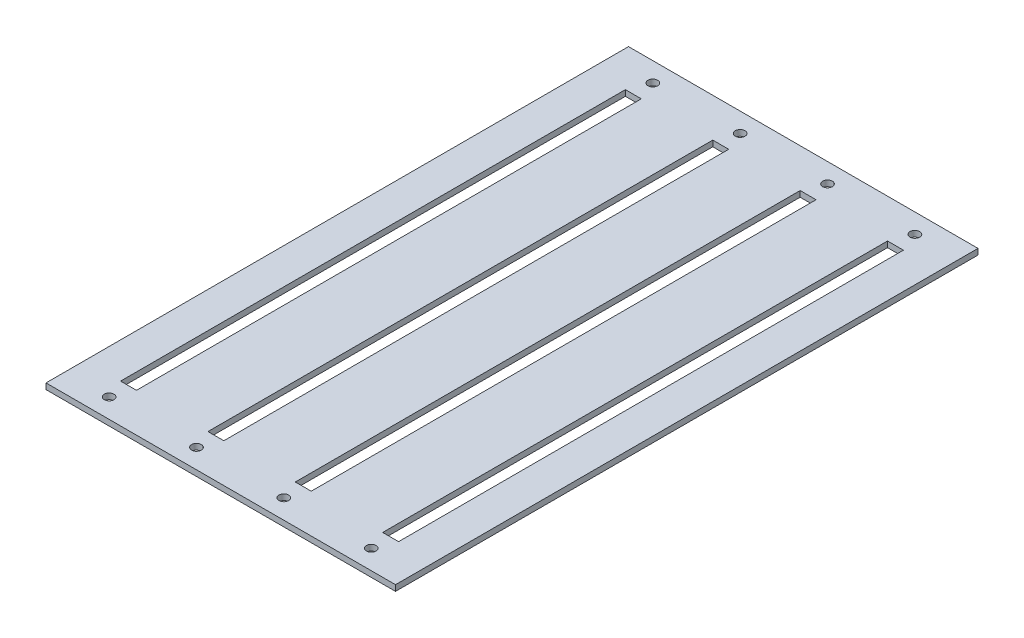
ISO-10303-21;
HEADER;
FILE_DESCRIPTION(('STEP AP214'),'2;1');
FILE_NAME('part.step','',(''),(''),'','','');
FILE_SCHEMA(('AUTOMOTIVE_DESIGN { 1 0 10303 214 1 1 1 1 }'));
ENDSEC;
DATA;
#1=APPLICATION_CONTEXT('core data for automotive mechanical design processes');
#2=APPLICATION_PROTOCOL_DEFINITION('international standard','automotive_design',2000,#1);
#3=PRODUCT_CONTEXT('',#1,'mechanical');
#4=PRODUCT('Part','Part','',(#3));
#5=PRODUCT_RELATED_PRODUCT_CATEGORY('part','',(#4));
#6=PRODUCT_DEFINITION_FORMATION('','',#4);
#7=PRODUCT_DEFINITION_CONTEXT('part definition',#1,'design');
#8=PRODUCT_DEFINITION('design','',#6,#7);
#9=PRODUCT_DEFINITION_SHAPE('','',#8);
#10=(LENGTH_UNIT() NAMED_UNIT(*) SI_UNIT(.MILLI.,.METRE.));
#11=(NAMED_UNIT(*) PLANE_ANGLE_UNIT() SI_UNIT($,.RADIAN.));
#12=(NAMED_UNIT(*) SI_UNIT($,.STERADIAN.) SOLID_ANGLE_UNIT());
#13=UNCERTAINTY_MEASURE_WITH_UNIT(LENGTH_MEASURE(1.E-05),#10,'distance_accuracy_value','');
#14=(GEOMETRIC_REPRESENTATION_CONTEXT(3) GLOBAL_UNCERTAINTY_ASSIGNED_CONTEXT((#13)) GLOBAL_UNIT_ASSIGNED_CONTEXT((#10,
#11,#12)) REPRESENTATION_CONTEXT('',''));
#15=CARTESIAN_POINT('',(0.,0.,0.));
#16=DIRECTION('',(0.,0.,1.));
#17=DIRECTION('',(1.,0.,0.));
#18=AXIS2_PLACEMENT_3D('',#15,#16,#17);
#19=CARTESIAN_POINT('',(90.0000000000001,3.,150.));
#20=DIRECTION('',(-1.,0.,0.));
#21=DIRECTION('',(0.,0.,1.));
#22=AXIS2_PLACEMENT_3D('',#19,#20,#21);
#23=PLANE('',#22);
#24=DIRECTION('',(0.,0.,-1.));
#25=VECTOR('',#24,1.);
#26=CARTESIAN_POINT('',(90.0000000000001,0.,150.));
#27=LINE('',#26,#25);
#28=CARTESIAN_POINT('',(90.0000000000001,0.,150.));
#29=VERTEX_POINT('',#28);
#30=CARTESIAN_POINT('',(90.0000000000001,0.,-150.));
#31=VERTEX_POINT('',#30);
#32=EDGE_CURVE('E209',#29,#31,#27,.T.);
#33=ORIENTED_EDGE('',*,*,#32,.T.);
#34=DIRECTION('',(0.,-1.,0.));
#35=VECTOR('',#34,1.);
#36=CARTESIAN_POINT('',(90.0000000000001,3.,-150.));
#37=LINE('',#36,#35);
#38=CARTESIAN_POINT('',(90.0000000000001,3.,-150.));
#39=VERTEX_POINT('',#38);
#40=EDGE_CURVE('E11',#39,#31,#37,.T.);
#41=ORIENTED_EDGE('',*,*,#40,.F.);
#42=DIRECTION('',(0.,0.,-1.));
#43=VECTOR('',#42,1.);
#44=CARTESIAN_POINT('',(90.0000000000001,3.,150.));
#45=LINE('',#44,#43);
#46=CARTESIAN_POINT('',(90.0000000000001,3.,150.));
#47=VERTEX_POINT('',#46);
#48=EDGE_CURVE('E307',#47,#39,#45,.T.);
#49=ORIENTED_EDGE('',*,*,#48,.F.);
#50=DIRECTION('',(0.,-1.,0.));
#51=VECTOR('',#50,1.);
#52=CARTESIAN_POINT('',(90.0000000000001,3.,150.));
#53=LINE('',#52,#51);
#54=EDGE_CURVE('E317',#47,#29,#53,.T.);
#55=ORIENTED_EDGE('',*,*,#54,.T.);
#56=EDGE_LOOP('',(#33,#41,#49,#55));
#57=FACE_BOUND('',#56,.T.);
#58=ADVANCED_FACE('F33',(#57),#23,.F.);
#59=CARTESIAN_POINT('',(-89.9999999999999,3.,-150.));
#60=DIRECTION('',(0.,0.,1.));
#61=DIRECTION('',(1.,0.,0.));
#62=AXIS2_PLACEMENT_3D('',#59,#60,#61);
#63=PLANE('',#62);
#64=DIRECTION('',(-1.,0.,0.));
#65=VECTOR('',#64,1.);
#66=CARTESIAN_POINT('',(-89.9999999999999,0.,-150.));
#67=LINE('',#66,#65);
#68=CARTESIAN_POINT('',(-89.9999999999999,0.,-150.));
#69=VERTEX_POINT('',#68);
#70=EDGE_CURVE('E320',#31,#69,#67,.T.);
#71=ORIENTED_EDGE('',*,*,#70,.T.);
#72=DIRECTION('',(0.,-1.,0.));
#73=VECTOR('',#72,1.);
#74=CARTESIAN_POINT('',(-89.9999999999999,3.,-150.));
#75=LINE('',#74,#73);
#76=CARTESIAN_POINT('',(-89.9999999999999,3.,-150.));
#77=VERTEX_POINT('',#76);
#78=EDGE_CURVE('E40',#77,#69,#75,.T.);
#79=ORIENTED_EDGE('',*,*,#78,.F.);
#80=DIRECTION('',(-1.,0.,0.));
#81=VECTOR('',#80,1.);
#82=CARTESIAN_POINT('',(-89.9999999999999,3.,-150.));
#83=LINE('',#82,#81);
#84=EDGE_CURVE('E310',#39,#77,#83,.T.);
#85=ORIENTED_EDGE('',*,*,#84,.F.);
#86=ORIENTED_EDGE('',*,*,#40,.T.);
#87=EDGE_LOOP('',(#71,#79,#85,#86));
#88=FACE_BOUND('',#87,.T.);
#89=ADVANCED_FACE('F349',(#88),#63,.F.);
#90=CARTESIAN_POINT('',(-89.9999999999999,3.,150.));
#91=DIRECTION('',(1.,0.,0.));
#92=DIRECTION('',(0.,0.,-1.));
#93=AXIS2_PLACEMENT_3D('',#90,#91,#92);
#94=PLANE('',#93);
#95=DIRECTION('',(0.,0.,1.));
#96=VECTOR('',#95,1.);
#97=CARTESIAN_POINT('',(-89.9999999999999,0.,150.));
#98=LINE('',#97,#96);
#99=CARTESIAN_POINT('',(-89.9999999999999,0.,150.));
#100=VERTEX_POINT('',#99);
#101=EDGE_CURVE('E322',#69,#100,#98,.T.);
#102=ORIENTED_EDGE('',*,*,#101,.T.);
#103=DIRECTION('',(0.,-1.,0.));
#104=VECTOR('',#103,1.);
#105=CARTESIAN_POINT('',(-89.9999999999999,3.,150.));
#106=LINE('',#105,#104);
#107=CARTESIAN_POINT('',(-89.9999999999999,3.,150.));
#108=VERTEX_POINT('',#107);
#109=EDGE_CURVE('E327',#108,#100,#106,.T.);
#110=ORIENTED_EDGE('',*,*,#109,.F.);
#111=DIRECTION('',(0.,0.,1.));
#112=VECTOR('',#111,1.);
#113=CARTESIAN_POINT('',(-89.9999999999999,3.,150.));
#114=LINE('',#113,#112);
#115=EDGE_CURVE('E313',#77,#108,#114,.T.);
#116=ORIENTED_EDGE('',*,*,#115,.F.);
#117=ORIENTED_EDGE('',*,*,#78,.T.);
#118=EDGE_LOOP('',(#102,#110,#116,#117));
#119=FACE_BOUND('',#118,.T.);
#120=ADVANCED_FACE('F334',(#119),#94,.F.);
#121=CARTESIAN_POINT('',(-89.9999999999999,3.,150.));
#122=DIRECTION('',(0.,0.,-1.));
#123=DIRECTION('',(-1.,0.,0.));
#124=AXIS2_PLACEMENT_3D('',#121,#122,#123);
#125=PLANE('',#124);
#126=DIRECTION('',(1.,0.,0.));
#127=VECTOR('',#126,1.);
#128=CARTESIAN_POINT('',(-89.9999999999999,0.,150.));
#129=LINE('',#128,#127);
#130=EDGE_CURVE('E311',#100,#29,#129,.T.);
#131=ORIENTED_EDGE('',*,*,#130,.T.);
#132=ORIENTED_EDGE('',*,*,#54,.F.);
#133=DIRECTION('',(1.,0.,0.));
#134=VECTOR('',#133,1.);
#135=CARTESIAN_POINT('',(-89.9999999999999,3.,150.));
#136=LINE('',#135,#134);
#137=EDGE_CURVE('E315',#108,#47,#136,.T.);
#138=ORIENTED_EDGE('',*,*,#137,.F.);
#139=ORIENTED_EDGE('',*,*,#109,.T.);
#140=EDGE_LOOP('',(#131,#132,#138,#139));
#141=FACE_BOUND('',#140,.T.);
#142=ADVANCED_FACE('F342',(#141),#125,.F.);
#143=CARTESIAN_POINT('',(0.,3.,0.));
#144=DIRECTION('',(0.,-1.,0.));
#145=DIRECTION('',(0.,0.,-1.));
#146=AXIS2_PLACEMENT_3D('',#143,#144,#145);
#147=PLANE('',#146);
#148=CARTESIAN_POINT('',(-22.5000000000009,3.,140.));
#149=DIRECTION('',(0.,1.,0.));
#150=DIRECTION('',(0.,0.,1.));
#151=AXIS2_PLACEMENT_3D('',#148,#149,#150);
#152=CIRCLE('',#151,2.50000000000002);
#153=CARTESIAN_POINT('',(-22.5000000000009,3.,142.5));
#154=VERTEX_POINT('',#153);
#155=EDGE_CURVE('E467',#154,#154,#152,.T.);
#156=ORIENTED_EDGE('',*,*,#155,.F.);
#157=EDGE_LOOP('',(#156));
#158=FACE_BOUND('',#157,.T.);
#159=CARTESIAN_POINT('',(-67.4999999999989,3.,-140.));
#160=DIRECTION('',(0.,1.,0.));
#161=DIRECTION('',(0.,0.,1.));
#162=AXIS2_PLACEMENT_3D('',#159,#160,#161);
#163=CIRCLE('',#162,2.50000000000002);
#164=CARTESIAN_POINT('',(-67.4999999999989,3.,-137.5));
#165=VERTEX_POINT('',#164);
#166=EDGE_CURVE('E485',#165,#165,#163,.T.);
#167=ORIENTED_EDGE('',*,*,#166,.F.);
#168=EDGE_LOOP('',(#167));
#169=FACE_BOUND('',#168,.T.);
#170=CARTESIAN_POINT('',(67.4999999999999,3.,-140.));
#171=DIRECTION('',(0.,1.,0.));
#172=DIRECTION('',(0.,0.,-1.));
#173=AXIS2_PLACEMENT_3D('',#170,#171,#172);
#174=CIRCLE('',#173,2.5);
#175=CARTESIAN_POINT('',(67.4999999999999,3.,-142.5));
#176=VERTEX_POINT('',#175);
#177=EDGE_CURVE('E484',#176,#176,#174,.T.);
#178=ORIENTED_EDGE('',*,*,#177,.F.);
#179=EDGE_LOOP('',(#178));
#180=FACE_BOUND('',#179,.T.);
#181=CARTESIAN_POINT('',(-67.4999999999989,3.,140.));
#182=DIRECTION('',(0.,1.,0.));
#183=DIRECTION('',(0.,0.,-1.));
#184=AXIS2_PLACEMENT_3D('',#181,#182,#183);
#185=CIRCLE('',#184,2.50000000000002);
#186=CARTESIAN_POINT('',(-67.4999999999989,3.,137.5));
#187=VERTEX_POINT('',#186);
#188=EDGE_CURVE('E496',#187,#187,#185,.T.);
#189=ORIENTED_EDGE('',*,*,#188,.F.);
#190=EDGE_LOOP('',(#189));
#191=FACE_BOUND('',#190,.T.);
#192=CARTESIAN_POINT('',(22.5000000000018,3.,140.));
#193=DIRECTION('',(0.,1.,0.));
#194=DIRECTION('',(0.,0.,-1.));
#195=AXIS2_PLACEMENT_3D('',#192,#193,#194);
#196=CIRCLE('',#195,2.50000000000002);
#197=CARTESIAN_POINT('',(22.5000000000018,3.,137.5));
#198=VERTEX_POINT('',#197);
#199=EDGE_CURVE('E463',#198,#198,#196,.T.);
#200=ORIENTED_EDGE('',*,*,#199,.F.);
#201=EDGE_LOOP('',(#200));
#202=FACE_BOUND('',#201,.T.);
#203=CARTESIAN_POINT('',(22.5000000000018,3.,-140.));
#204=DIRECTION('',(0.,1.,0.));
#205=DIRECTION('',(0.,0.,1.));
#206=AXIS2_PLACEMENT_3D('',#203,#204,#205);
#207=CIRCLE('',#206,2.50000000000002);
#208=CARTESIAN_POINT('',(22.5000000000018,3.,-137.5));
#209=VERTEX_POINT('',#208);
#210=EDGE_CURVE('E470',#209,#209,#207,.T.);
#211=ORIENTED_EDGE('',*,*,#210,.F.);
#212=EDGE_LOOP('',(#211));
#213=FACE_BOUND('',#212,.T.);
#214=CARTESIAN_POINT('',(-22.5000000000009,3.,-140.));
#215=DIRECTION('',(0.,1.,0.));
#216=DIRECTION('',(0.,0.,-1.));
#217=AXIS2_PLACEMENT_3D('',#214,#215,#216);
#218=CIRCLE('',#217,2.50000000000002);
#219=CARTESIAN_POINT('',(-22.5000000000009,3.,-142.5));
#220=VERTEX_POINT('',#219);
#221=EDGE_CURVE('E478',#220,#220,#218,.T.);
#222=ORIENTED_EDGE('',*,*,#221,.F.);
#223=EDGE_LOOP('',(#222));
#224=FACE_BOUND('',#223,.T.);
#225=CARTESIAN_POINT('',(67.4999999999999,3.,140.));
#226=DIRECTION('',(0.,1.,0.));
#227=DIRECTION('',(0.,0.,1.));
#228=AXIS2_PLACEMENT_3D('',#225,#226,#227);
#229=CIRCLE('',#228,2.5);
#230=CARTESIAN_POINT('',(67.4999999999999,3.,142.5));
#231=VERTEX_POINT('',#230);
#232=EDGE_CURVE('E196',#231,#231,#229,.T.);
#233=ORIENTED_EDGE('',*,*,#232,.F.);
#234=EDGE_LOOP('',(#233));
#235=FACE_BOUND('',#234,.T.);
#236=DIRECTION('',(-1.,0.,0.));
#237=VECTOR('',#236,1.);
#238=CARTESIAN_POINT('',(-71.5999999999999,3.,-130.));
#239=LINE('',#238,#237);
#240=CARTESIAN_POINT('',(-63.3999999999999,3.,-130.));
#241=VERTEX_POINT('',#240);
#242=CARTESIAN_POINT('',(-71.5999999999999,3.,-130.));
#243=VERTEX_POINT('',#242);
#244=EDGE_CURVE('E202',#241,#243,#239,.T.);
#245=ORIENTED_EDGE('',*,*,#244,.F.);
#246=DIRECTION('',(0.,0.,-1.));
#247=VECTOR('',#246,1.);
#248=CARTESIAN_POINT('',(-63.3999999999999,3.,-130.));
#249=LINE('',#248,#247);
#250=CARTESIAN_POINT('',(-63.3999999999999,3.,130.));
#251=VERTEX_POINT('',#250);
#252=EDGE_CURVE('E47',#251,#241,#249,.T.);
#253=ORIENTED_EDGE('',*,*,#252,.F.);
#254=DIRECTION('',(1.,0.,0.));
#255=VECTOR('',#254,1.);
#256=CARTESIAN_POINT('',(-71.5999999999999,3.,130.));
#257=LINE('',#256,#255);
#258=CARTESIAN_POINT('',(-71.5999999999999,3.,130.));
#259=VERTEX_POINT('',#258);
#260=EDGE_CURVE('E190',#259,#251,#257,.T.);
#261=ORIENTED_EDGE('',*,*,#260,.F.);
#262=DIRECTION('',(0.,0.,1.));
#263=VECTOR('',#262,1.);
#264=CARTESIAN_POINT('',(-71.5999999999999,3.,-130.));
#265=LINE('',#264,#263);
#266=EDGE_CURVE('E193',#243,#259,#265,.T.);
#267=ORIENTED_EDGE('',*,*,#266,.F.);
#268=EDGE_LOOP('',(#245,#253,#261,#267));
#269=FACE_BOUND('',#268,.T.);
#270=DIRECTION('',(0.,0.,1.));
#271=VECTOR('',#270,1.);
#272=CARTESIAN_POINT('',(63.3999999999999,3.,-130.));
#273=LINE('',#272,#271);
#274=CARTESIAN_POINT('',(63.3999999999999,3.,-130.));
#275=VERTEX_POINT('',#274);
#276=CARTESIAN_POINT('',(63.3999999999999,3.,130.));
#277=VERTEX_POINT('',#276);
#278=EDGE_CURVE('E228',#275,#277,#273,.T.);
#279=ORIENTED_EDGE('',*,*,#278,.F.);
#280=DIRECTION('',(-1.,0.,0.));
#281=VECTOR('',#280,1.);
#282=CARTESIAN_POINT('',(71.5999999999999,3.,-130.));
#283=LINE('',#282,#281);
#284=CARTESIAN_POINT('',(71.5999999999999,3.,-130.));
#285=VERTEX_POINT('',#284);
#286=EDGE_CURVE('E55',#285,#275,#283,.T.);
#287=ORIENTED_EDGE('',*,*,#286,.F.);
#288=DIRECTION('',(0.,0.,-1.));
#289=VECTOR('',#288,1.);
#290=CARTESIAN_POINT('',(71.5999999999999,3.,-130.));
#291=LINE('',#290,#289);
#292=CARTESIAN_POINT('',(71.5999999999999,3.,130.));
#293=VERTEX_POINT('',#292);
#294=EDGE_CURVE('E217',#293,#285,#291,.T.);
#295=ORIENTED_EDGE('',*,*,#294,.F.);
#296=DIRECTION('',(1.,0.,0.));
#297=VECTOR('',#296,1.);
#298=CARTESIAN_POINT('',(71.5999999999999,3.,130.));
#299=LINE('',#298,#297);
#300=EDGE_CURVE('E232',#277,#293,#299,.T.);
#301=ORIENTED_EDGE('',*,*,#300,.F.);
#302=EDGE_LOOP('',(#279,#287,#295,#301));
#303=FACE_BOUND('',#302,.T.);
#304=DIRECTION('',(0.,0.,1.));
#305=VECTOR('',#304,1.);
#306=CARTESIAN_POINT('',(18.3999999999999,3.,-130.));
#307=LINE('',#306,#305);
#308=CARTESIAN_POINT('',(18.3999999999999,3.,-130.));
#309=VERTEX_POINT('',#308);
#310=CARTESIAN_POINT('',(18.3999999999999,3.,130.));
#311=VERTEX_POINT('',#310);
#312=EDGE_CURVE('E259',#309,#311,#307,.T.);
#313=ORIENTED_EDGE('',*,*,#312,.F.);
#314=DIRECTION('',(-1.,0.,0.));
#315=VECTOR('',#314,1.);
#316=CARTESIAN_POINT('',(26.5999999999999,3.,-130.));
#317=LINE('',#316,#315);
#318=CARTESIAN_POINT('',(26.5999999999999,3.,-130.));
#319=VERTEX_POINT('',#318);
#320=EDGE_CURVE('E257',#319,#309,#317,.T.);
#321=ORIENTED_EDGE('',*,*,#320,.F.);
#322=DIRECTION('',(0.,0.,-1.));
#323=VECTOR('',#322,1.);
#324=CARTESIAN_POINT('',(26.5999999999999,3.,-130.));
#325=LINE('',#324,#323);
#326=CARTESIAN_POINT('',(26.5999999999999,3.,130.));
#327=VERTEX_POINT('',#326);
#328=EDGE_CURVE('E247',#327,#319,#325,.T.);
#329=ORIENTED_EDGE('',*,*,#328,.F.);
#330=DIRECTION('',(1.,0.,0.));
#331=VECTOR('',#330,1.);
#332=CARTESIAN_POINT('',(26.5999999999999,3.,130.));
#333=LINE('',#332,#331);
#334=EDGE_CURVE('E263',#311,#327,#333,.T.);
#335=ORIENTED_EDGE('',*,*,#334,.F.);
#336=EDGE_LOOP('',(#313,#321,#329,#335));
#337=FACE_BOUND('',#336,.T.);
#338=DIRECTION('',(-1.,0.,0.));
#339=VECTOR('',#338,1.);
#340=CARTESIAN_POINT('',(-26.5999999999999,3.,-130.));
#341=LINE('',#340,#339);
#342=CARTESIAN_POINT('',(-18.3999999999999,3.,-130.));
#343=VERTEX_POINT('',#342);
#344=CARTESIAN_POINT('',(-26.5999999999999,3.,-130.));
#345=VERTEX_POINT('',#344);
#346=EDGE_CURVE('E291',#343,#345,#341,.T.);
#347=ORIENTED_EDGE('',*,*,#346,.F.);
#348=DIRECTION('',(0.,0.,-1.));
#349=VECTOR('',#348,1.);
#350=CARTESIAN_POINT('',(-18.3999999999999,3.,-130.));
#351=LINE('',#350,#349);
#352=CARTESIAN_POINT('',(-18.3999999999999,3.,130.));
#353=VERTEX_POINT('',#352);
#354=EDGE_CURVE('E289',#353,#343,#351,.T.);
#355=ORIENTED_EDGE('',*,*,#354,.F.);
#356=DIRECTION('',(1.,0.,0.));
#357=VECTOR('',#356,1.);
#358=CARTESIAN_POINT('',(-26.5999999999999,3.,130.));
#359=LINE('',#358,#357);
#360=CARTESIAN_POINT('',(-26.5999999999999,3.,130.));
#361=VERTEX_POINT('',#360);
#362=EDGE_CURVE('E279',#361,#353,#359,.T.);
#363=ORIENTED_EDGE('',*,*,#362,.F.);
#364=DIRECTION('',(0.,0.,1.));
#365=VECTOR('',#364,1.);
#366=CARTESIAN_POINT('',(-26.5999999999999,3.,-130.));
#367=LINE('',#366,#365);
#368=EDGE_CURVE('E295',#345,#361,#367,.T.);
#369=ORIENTED_EDGE('',*,*,#368,.F.);
#370=EDGE_LOOP('',(#347,#355,#363,#369));
#371=FACE_BOUND('',#370,.T.);
#372=ORIENTED_EDGE('',*,*,#48,.T.);
#373=ORIENTED_EDGE('',*,*,#84,.T.);
#374=ORIENTED_EDGE('',*,*,#115,.T.);
#375=ORIENTED_EDGE('',*,*,#137,.T.);
#376=EDGE_LOOP('',(#372,#373,#374,#375));
#377=FACE_BOUND('',#376,.T.);
#378=ADVANCED_FACE('F348',(#158,#169,#180,#191,#202,#213,#224,#235,#269,#303,#337,#371,#377),
#147,.F.);
#379=CARTESIAN_POINT('',(0.,0.,0.));
#380=DIRECTION('',(0.,-1.,0.));
#381=DIRECTION('',(0.,0.,-1.));
#382=AXIS2_PLACEMENT_3D('',#379,#380,#381);
#383=PLANE('',#382);
#384=CARTESIAN_POINT('',(-22.5000000000009,0.,140.));
#385=DIRECTION('',(0.,1.,0.));
#386=DIRECTION('',(0.,0.,1.));
#387=AXIS2_PLACEMENT_3D('',#384,#385,#386);
#388=CIRCLE('',#387,2.50000000000002);
#389=CARTESIAN_POINT('',(-22.5000000000009,0.,142.5));
#390=VERTEX_POINT('',#389);
#391=EDGE_CURVE('E488',#390,#390,#388,.T.);
#392=ORIENTED_EDGE('',*,*,#391,.T.);
#393=EDGE_LOOP('',(#392));
#394=FACE_BOUND('',#393,.T.);
#395=CARTESIAN_POINT('',(-67.4999999999989,0.,-140.));
#396=DIRECTION('',(0.,1.,0.));
#397=DIRECTION('',(0.,0.,1.));
#398=AXIS2_PLACEMENT_3D('',#395,#396,#397);
#399=CIRCLE('',#398,2.50000000000002);
#400=CARTESIAN_POINT('',(-67.4999999999989,0.,-137.5));
#401=VERTEX_POINT('',#400);
#402=EDGE_CURVE('E481',#401,#401,#399,.T.);
#403=ORIENTED_EDGE('',*,*,#402,.T.);
#404=EDGE_LOOP('',(#403));
#405=FACE_BOUND('',#404,.T.);
#406=CARTESIAN_POINT('',(67.4999999999999,0.,-140.));
#407=DIRECTION('',(0.,1.,0.));
#408=DIRECTION('',(0.,0.,-1.));
#409=AXIS2_PLACEMENT_3D('',#406,#407,#408);
#410=CIRCLE('',#409,2.5);
#411=CARTESIAN_POINT('',(67.4999999999999,0.,-142.5));
#412=VERTEX_POINT('',#411);
#413=EDGE_CURVE('E499',#412,#412,#410,.T.);
#414=ORIENTED_EDGE('',*,*,#413,.T.);
#415=EDGE_LOOP('',(#414));
#416=FACE_BOUND('',#415,.T.);
#417=CARTESIAN_POINT('',(-67.4999999999989,0.,140.));
#418=DIRECTION('',(0.,1.,0.));
#419=DIRECTION('',(0.,0.,-1.));
#420=AXIS2_PLACEMENT_3D('',#417,#418,#419);
#421=CIRCLE('',#420,2.50000000000002);
#422=CARTESIAN_POINT('',(-67.4999999999989,0.,137.5));
#423=VERTEX_POINT('',#422);
#424=EDGE_CURVE('E493',#423,#423,#421,.T.);
#425=ORIENTED_EDGE('',*,*,#424,.T.);
#426=EDGE_LOOP('',(#425));
#427=FACE_BOUND('',#426,.T.);
#428=CARTESIAN_POINT('',(22.5000000000018,0.,140.));
#429=DIRECTION('',(0.,1.,0.));
#430=DIRECTION('',(0.,0.,-1.));
#431=AXIS2_PLACEMENT_3D('',#428,#429,#430);
#432=CIRCLE('',#431,2.50000000000002);
#433=CARTESIAN_POINT('',(22.5000000000018,0.,137.5));
#434=VERTEX_POINT('',#433);
#435=EDGE_CURVE('E460',#434,#434,#432,.T.);
#436=ORIENTED_EDGE('',*,*,#435,.T.);
#437=EDGE_LOOP('',(#436));
#438=FACE_BOUND('',#437,.T.);
#439=CARTESIAN_POINT('',(22.5000000000018,0.,-140.));
#440=DIRECTION('',(0.,1.,0.));
#441=DIRECTION('',(0.,0.,1.));
#442=AXIS2_PLACEMENT_3D('',#439,#440,#441);
#443=CIRCLE('',#442,2.50000000000002);
#444=CARTESIAN_POINT('',(22.5000000000018,0.,-137.5));
#445=VERTEX_POINT('',#444);
#446=EDGE_CURVE('E465',#445,#445,#443,.T.);
#447=ORIENTED_EDGE('',*,*,#446,.T.);
#448=EDGE_LOOP('',(#447));
#449=FACE_BOUND('',#448,.T.);
#450=CARTESIAN_POINT('',(-22.5000000000009,0.,-140.));
#451=DIRECTION('',(0.,1.,0.));
#452=DIRECTION('',(0.,0.,-1.));
#453=AXIS2_PLACEMENT_3D('',#450,#451,#452);
#454=CIRCLE('',#453,2.50000000000002);
#455=CARTESIAN_POINT('',(-22.5000000000009,0.,-142.5));
#456=VERTEX_POINT('',#455);
#457=EDGE_CURVE('E475',#456,#456,#454,.T.);
#458=ORIENTED_EDGE('',*,*,#457,.T.);
#459=EDGE_LOOP('',(#458));
#460=FACE_BOUND('',#459,.T.);
#461=CARTESIAN_POINT('',(67.4999999999999,0.,140.));
#462=DIRECTION('',(0.,1.,0.));
#463=DIRECTION('',(0.,0.,1.));
#464=AXIS2_PLACEMENT_3D('',#461,#462,#463);
#465=CIRCLE('',#464,2.5);
#466=CARTESIAN_POINT('',(67.4999999999999,0.,142.5));
#467=VERTEX_POINT('',#466);
#468=EDGE_CURVE('E292',#467,#467,#465,.T.);
#469=ORIENTED_EDGE('',*,*,#468,.T.);
#470=EDGE_LOOP('',(#469));
#471=FACE_BOUND('',#470,.T.);
#472=DIRECTION('',(0.,0.,-1.));
#473=VECTOR('',#472,1.);
#474=CARTESIAN_POINT('',(-63.3999999999999,0.,-130.));
#475=LINE('',#474,#473);
#476=CARTESIAN_POINT('',(-63.3999999999999,0.,130.));
#477=VERTEX_POINT('',#476);
#478=CARTESIAN_POINT('',(-63.3999999999999,0.,-130.));
#479=VERTEX_POINT('',#478);
#480=EDGE_CURVE('E171',#477,#479,#475,.T.);
#481=ORIENTED_EDGE('',*,*,#480,.T.);
#482=DIRECTION('',(-1.,0.,0.));
#483=VECTOR('',#482,1.);
#484=CARTESIAN_POINT('',(-71.5999999999999,0.,-130.));
#485=LINE('',#484,#483);
#486=CARTESIAN_POINT('',(-71.5999999999999,0.,-130.));
#487=VERTEX_POINT('',#486);
#488=EDGE_CURVE('E181',#479,#487,#485,.T.);
#489=ORIENTED_EDGE('',*,*,#488,.T.);
#490=DIRECTION('',(0.,0.,1.));
#491=VECTOR('',#490,1.);
#492=CARTESIAN_POINT('',(-71.5999999999999,0.,-130.));
#493=LINE('',#492,#491);
#494=CARTESIAN_POINT('',(-71.5999999999999,0.,130.));
#495=VERTEX_POINT('',#494);
#496=EDGE_CURVE('E185',#487,#495,#493,.T.);
#497=ORIENTED_EDGE('',*,*,#496,.T.);
#498=DIRECTION('',(1.,0.,0.));
#499=VECTOR('',#498,1.);
#500=CARTESIAN_POINT('',(-71.5999999999999,0.,130.));
#501=LINE('',#500,#499);
#502=EDGE_CURVE('E177',#495,#477,#501,.T.);
#503=ORIENTED_EDGE('',*,*,#502,.T.);
#504=EDGE_LOOP('',(#481,#489,#497,#503));
#505=FACE_BOUND('',#504,.T.);
#506=DIRECTION('',(-1.,0.,0.));
#507=VECTOR('',#506,1.);
#508=CARTESIAN_POINT('',(71.5999999999999,0.,-130.));
#509=LINE('',#508,#507);
#510=CARTESIAN_POINT('',(71.5999999999999,0.,-130.));
#511=VERTEX_POINT('',#510);
#512=CARTESIAN_POINT('',(63.3999999999999,0.,-130.));
#513=VERTEX_POINT('',#512);
#514=EDGE_CURVE('E213',#511,#513,#509,.T.);
#515=ORIENTED_EDGE('',*,*,#514,.T.);
#516=DIRECTION('',(0.,0.,1.));
#517=VECTOR('',#516,1.);
#518=CARTESIAN_POINT('',(63.3999999999999,0.,-130.));
#519=LINE('',#518,#517);
#520=CARTESIAN_POINT('',(63.3999999999999,0.,130.));
#521=VERTEX_POINT('',#520);
#522=EDGE_CURVE('E216',#513,#521,#519,.T.);
#523=ORIENTED_EDGE('',*,*,#522,.T.);
#524=DIRECTION('',(1.,0.,0.));
#525=VECTOR('',#524,1.);
#526=CARTESIAN_POINT('',(71.5999999999999,0.,130.));
#527=LINE('',#526,#525);
#528=CARTESIAN_POINT('',(71.5999999999999,0.,130.));
#529=VERTEX_POINT('',#528);
#530=EDGE_CURVE('E220',#521,#529,#527,.T.);
#531=ORIENTED_EDGE('',*,*,#530,.T.);
#532=DIRECTION('',(0.,0.,-1.));
#533=VECTOR('',#532,1.);
#534=CARTESIAN_POINT('',(71.5999999999999,0.,-130.));
#535=LINE('',#534,#533);
#536=EDGE_CURVE('E223',#529,#511,#535,.T.);
#537=ORIENTED_EDGE('',*,*,#536,.T.);
#538=EDGE_LOOP('',(#515,#523,#531,#537));
#539=FACE_BOUND('',#538,.T.);
#540=DIRECTION('',(-1.,0.,0.));
#541=VECTOR('',#540,1.);
#542=CARTESIAN_POINT('',(26.5999999999999,0.,-130.));
#543=LINE('',#542,#541);
#544=CARTESIAN_POINT('',(26.5999999999999,0.,-130.));
#545=VERTEX_POINT('',#544);
#546=CARTESIAN_POINT('',(18.3999999999999,0.,-130.));
#547=VERTEX_POINT('',#546);
#548=EDGE_CURVE('E243',#545,#547,#543,.T.);
#549=ORIENTED_EDGE('',*,*,#548,.T.);
#550=DIRECTION('',(0.,0.,1.));
#551=VECTOR('',#550,1.);
#552=CARTESIAN_POINT('',(18.3999999999999,0.,-130.));
#553=LINE('',#552,#551);
#554=CARTESIAN_POINT('',(18.3999999999999,0.,130.));
#555=VERTEX_POINT('',#554);
#556=EDGE_CURVE('E246',#547,#555,#553,.T.);
#557=ORIENTED_EDGE('',*,*,#556,.T.);
#558=DIRECTION('',(1.,0.,0.));
#559=VECTOR('',#558,1.);
#560=CARTESIAN_POINT('',(26.5999999999999,0.,130.));
#561=LINE('',#560,#559);
#562=CARTESIAN_POINT('',(26.5999999999999,0.,130.));
#563=VERTEX_POINT('',#562);
#564=EDGE_CURVE('E250',#555,#563,#561,.T.);
#565=ORIENTED_EDGE('',*,*,#564,.T.);
#566=DIRECTION('',(0.,0.,-1.));
#567=VECTOR('',#566,1.);
#568=CARTESIAN_POINT('',(26.5999999999999,0.,-130.));
#569=LINE('',#568,#567);
#570=EDGE_CURVE('E253',#563,#545,#569,.T.);
#571=ORIENTED_EDGE('',*,*,#570,.T.);
#572=EDGE_LOOP('',(#549,#557,#565,#571));
#573=FACE_BOUND('',#572,.T.);
#574=DIRECTION('',(0.,0.,-1.));
#575=VECTOR('',#574,1.);
#576=CARTESIAN_POINT('',(-18.3999999999999,0.,-130.));
#577=LINE('',#576,#575);
#578=CARTESIAN_POINT('',(-18.3999999999999,0.,130.));
#579=VERTEX_POINT('',#578);
#580=CARTESIAN_POINT('',(-18.3999999999999,0.,-130.));
#581=VERTEX_POINT('',#580);
#582=EDGE_CURVE('E275',#579,#581,#577,.T.);
#583=ORIENTED_EDGE('',*,*,#582,.T.);
#584=DIRECTION('',(-1.,0.,0.));
#585=VECTOR('',#584,1.);
#586=CARTESIAN_POINT('',(-26.5999999999999,0.,-130.));
#587=LINE('',#586,#585);
#588=CARTESIAN_POINT('',(-26.5999999999999,0.,-130.));
#589=VERTEX_POINT('',#588);
#590=EDGE_CURVE('E278',#581,#589,#587,.T.);
#591=ORIENTED_EDGE('',*,*,#590,.T.);
#592=DIRECTION('',(0.,0.,1.));
#593=VECTOR('',#592,1.);
#594=CARTESIAN_POINT('',(-26.5999999999999,0.,-130.));
#595=LINE('',#594,#593);
#596=CARTESIAN_POINT('',(-26.5999999999999,0.,130.));
#597=VERTEX_POINT('',#596);
#598=EDGE_CURVE('E282',#589,#597,#595,.T.);
#599=ORIENTED_EDGE('',*,*,#598,.T.);
#600=DIRECTION('',(1.,0.,0.));
#601=VECTOR('',#600,1.);
#602=CARTESIAN_POINT('',(-26.5999999999999,0.,130.));
#603=LINE('',#602,#601);
#604=EDGE_CURVE('E285',#597,#579,#603,.T.);
#605=ORIENTED_EDGE('',*,*,#604,.T.);
#606=EDGE_LOOP('',(#583,#591,#599,#605));
#607=FACE_BOUND('',#606,.T.);
#608=ORIENTED_EDGE('',*,*,#32,.F.);
#609=ORIENTED_EDGE('',*,*,#130,.F.);
#610=ORIENTED_EDGE('',*,*,#101,.F.);
#611=ORIENTED_EDGE('',*,*,#70,.F.);
#612=EDGE_LOOP('',(#608,#609,#610,#611));
#613=FACE_BOUND('',#612,.T.);
#614=ADVANCED_FACE('F187',(#394,#405,#416,#427,#438,#449,#460,#471,#505,#539,#573,#607,#613),
#383,.T.);
#615=CARTESIAN_POINT('',(-18.3999999999999,0.,-130.));
#616=DIRECTION('',(1.,0.,0.));
#617=DIRECTION('',(0.,0.,-1.));
#618=AXIS2_PLACEMENT_3D('',#615,#616,#617);
#619=PLANE('',#618);
#620=ORIENTED_EDGE('',*,*,#354,.T.);
#621=DIRECTION('',(0.,1.,0.));
#622=VECTOR('',#621,1.);
#623=CARTESIAN_POINT('',(-18.3999999999999,0.,-130.));
#624=LINE('',#623,#622);
#625=EDGE_CURVE('E288',#581,#343,#624,.T.);
#626=ORIENTED_EDGE('',*,*,#625,.F.);
#627=ORIENTED_EDGE('',*,*,#582,.F.);
#628=DIRECTION('',(0.,1.,0.));
#629=VECTOR('',#628,1.);
#630=CARTESIAN_POINT('',(-18.3999999999999,0.,130.));
#631=LINE('',#630,#629);
#632=EDGE_CURVE('E260',#579,#353,#631,.T.);
#633=ORIENTED_EDGE('',*,*,#632,.T.);
#634=EDGE_LOOP('',(#620,#626,#627,#633));
#635=FACE_BOUND('',#634,.T.);
#636=ADVANCED_FACE('F361',(#635),#619,.F.);
#637=CARTESIAN_POINT('',(-26.5999999999999,0.,130.));
#638=DIRECTION('',(0.,0.,1.));
#639=DIRECTION('',(1.,0.,0.));
#640=AXIS2_PLACEMENT_3D('',#637,#638,#639);
#641=PLANE('',#640);
#642=ORIENTED_EDGE('',*,*,#362,.T.);
#643=ORIENTED_EDGE('',*,*,#632,.F.);
#644=ORIENTED_EDGE('',*,*,#604,.F.);
#645=DIRECTION('',(0.,1.,0.));
#646=VECTOR('',#645,1.);
#647=CARTESIAN_POINT('',(-26.5999999999999,0.,130.));
#648=LINE('',#647,#646);
#649=EDGE_CURVE('E301',#597,#361,#648,.T.);
#650=ORIENTED_EDGE('',*,*,#649,.T.);
#651=EDGE_LOOP('',(#642,#643,#644,#650));
#652=FACE_BOUND('',#651,.T.);
#653=ADVANCED_FACE('F368',(#652),#641,.F.);
#654=CARTESIAN_POINT('',(-26.5999999999999,0.,-130.));
#655=DIRECTION('',(-1.,0.,0.));
#656=DIRECTION('',(0.,0.,1.));
#657=AXIS2_PLACEMENT_3D('',#654,#655,#656);
#658=PLANE('',#657);
#659=ORIENTED_EDGE('',*,*,#368,.T.);
#660=ORIENTED_EDGE('',*,*,#649,.F.);
#661=ORIENTED_EDGE('',*,*,#598,.F.);
#662=DIRECTION('',(0.,1.,0.));
#663=VECTOR('',#662,1.);
#664=CARTESIAN_POINT('',(-26.5999999999999,0.,-130.));
#665=LINE('',#664,#663);
#666=EDGE_CURVE('E303',#589,#345,#665,.T.);
#667=ORIENTED_EDGE('',*,*,#666,.T.);
#668=EDGE_LOOP('',(#659,#660,#661,#667));
#669=FACE_BOUND('',#668,.T.);
#670=ADVANCED_FACE('F374',(#669),#658,.F.);
#671=CARTESIAN_POINT('',(-26.5999999999999,0.,-130.));
#672=DIRECTION('',(0.,0.,-1.));
#673=DIRECTION('',(-1.,0.,0.));
#674=AXIS2_PLACEMENT_3D('',#671,#672,#673);
#675=PLANE('',#674);
#676=ORIENTED_EDGE('',*,*,#346,.T.);
#677=ORIENTED_EDGE('',*,*,#666,.F.);
#678=ORIENTED_EDGE('',*,*,#590,.F.);
#679=ORIENTED_EDGE('',*,*,#625,.T.);
#680=EDGE_LOOP('',(#676,#677,#678,#679));
#681=FACE_BOUND('',#680,.T.);
#682=ADVANCED_FACE('F370',(#681),#675,.F.);
#683=CARTESIAN_POINT('',(26.5999999999999,0.,-130.));
#684=DIRECTION('',(0.,0.,-1.));
#685=DIRECTION('',(-1.,0.,0.));
#686=AXIS2_PLACEMENT_3D('',#683,#684,#685);
#687=PLANE('',#686);
#688=ORIENTED_EDGE('',*,*,#320,.T.);
#689=DIRECTION('',(0.,1.,0.));
#690=VECTOR('',#689,1.);
#691=CARTESIAN_POINT('',(18.3999999999999,0.,-130.));
#692=LINE('',#691,#690);
#693=EDGE_CURVE('E256',#547,#309,#692,.T.);
#694=ORIENTED_EDGE('',*,*,#693,.F.);
#695=ORIENTED_EDGE('',*,*,#548,.F.);
#696=DIRECTION('',(0.,1.,0.));
#697=VECTOR('',#696,1.);
#698=CARTESIAN_POINT('',(26.5999999999999,0.,-130.));
#699=LINE('',#698,#697);
#700=EDGE_CURVE('E229',#545,#319,#699,.T.);
#701=ORIENTED_EDGE('',*,*,#700,.T.);
#702=EDGE_LOOP('',(#688,#694,#695,#701));
#703=FACE_BOUND('',#702,.T.);
#704=ADVANCED_FACE('F373',(#703),#687,.F.);
#705=CARTESIAN_POINT('',(26.5999999999999,0.,-130.));
#706=DIRECTION('',(1.,0.,0.));
#707=DIRECTION('',(0.,0.,-1.));
#708=AXIS2_PLACEMENT_3D('',#705,#706,#707);
#709=PLANE('',#708);
#710=ORIENTED_EDGE('',*,*,#328,.T.);
#711=ORIENTED_EDGE('',*,*,#700,.F.);
#712=ORIENTED_EDGE('',*,*,#570,.F.);
#713=DIRECTION('',(0.,1.,0.));
#714=VECTOR('',#713,1.);
#715=CARTESIAN_POINT('',(26.5999999999999,0.,130.));
#716=LINE('',#715,#714);
#717=EDGE_CURVE('E269',#563,#327,#716,.T.);
#718=ORIENTED_EDGE('',*,*,#717,.T.);
#719=EDGE_LOOP('',(#710,#711,#712,#718));
#720=FACE_BOUND('',#719,.T.);
#721=ADVANCED_FACE('F384',(#720),#709,.F.);
#722=CARTESIAN_POINT('',(26.5999999999999,0.,130.));
#723=DIRECTION('',(0.,0.,1.));
#724=DIRECTION('',(1.,0.,0.));
#725=AXIS2_PLACEMENT_3D('',#722,#723,#724);
#726=PLANE('',#725);
#727=ORIENTED_EDGE('',*,*,#334,.T.);
#728=ORIENTED_EDGE('',*,*,#717,.F.);
#729=ORIENTED_EDGE('',*,*,#564,.F.);
#730=DIRECTION('',(0.,1.,0.));
#731=VECTOR('',#730,1.);
#732=CARTESIAN_POINT('',(18.3999999999999,0.,130.));
#733=LINE('',#732,#731);
#734=EDGE_CURVE('E271',#555,#311,#733,.T.);
#735=ORIENTED_EDGE('',*,*,#734,.T.);
#736=EDGE_LOOP('',(#727,#728,#729,#735));
#737=FACE_BOUND('',#736,.T.);
#738=ADVANCED_FACE('F390',(#737),#726,.F.);
#739=CARTESIAN_POINT('',(18.3999999999999,0.,-130.));
#740=DIRECTION('',(-1.,0.,0.));
#741=DIRECTION('',(0.,0.,1.));
#742=AXIS2_PLACEMENT_3D('',#739,#740,#741);
#743=PLANE('',#742);
#744=ORIENTED_EDGE('',*,*,#312,.T.);
#745=ORIENTED_EDGE('',*,*,#734,.F.);
#746=ORIENTED_EDGE('',*,*,#556,.F.);
#747=ORIENTED_EDGE('',*,*,#693,.T.);
#748=EDGE_LOOP('',(#744,#745,#746,#747));
#749=FACE_BOUND('',#748,.T.);
#750=ADVANCED_FACE('F386',(#749),#743,.F.);
#751=CARTESIAN_POINT('',(71.5999999999999,0.,-130.));
#752=DIRECTION('',(0.,0.,-1.));
#753=DIRECTION('',(-1.,0.,0.));
#754=AXIS2_PLACEMENT_3D('',#751,#752,#753);
#755=PLANE('',#754);
#756=ORIENTED_EDGE('',*,*,#286,.T.);
#757=DIRECTION('',(0.,1.,0.));
#758=VECTOR('',#757,1.);
#759=CARTESIAN_POINT('',(63.3999999999999,0.,-130.));
#760=LINE('',#759,#758);
#761=EDGE_CURVE('E226',#513,#275,#760,.T.);
#762=ORIENTED_EDGE('',*,*,#761,.F.);
#763=ORIENTED_EDGE('',*,*,#514,.F.);
#764=DIRECTION('',(0.,1.,0.));
#765=VECTOR('',#764,1.);
#766=CARTESIAN_POINT('',(71.5999999999999,0.,-130.));
#767=LINE('',#766,#765);
#768=EDGE_CURVE('E203',#511,#285,#767,.T.);
#769=ORIENTED_EDGE('',*,*,#768,.T.);
#770=EDGE_LOOP('',(#756,#762,#763,#769));
#771=FACE_BOUND('',#770,.T.);
#772=ADVANCED_FACE('F389',(#771),#755,.F.);
#773=CARTESIAN_POINT('',(71.5999999999999,0.,-130.));
#774=DIRECTION('',(1.,0.,0.));
#775=DIRECTION('',(0.,0.,-1.));
#776=AXIS2_PLACEMENT_3D('',#773,#774,#775);
#777=PLANE('',#776);
#778=ORIENTED_EDGE('',*,*,#294,.T.);
#779=ORIENTED_EDGE('',*,*,#768,.F.);
#780=ORIENTED_EDGE('',*,*,#536,.F.);
#781=DIRECTION('',(0.,1.,0.));
#782=VECTOR('',#781,1.);
#783=CARTESIAN_POINT('',(71.5999999999999,0.,130.));
#784=LINE('',#783,#782);
#785=EDGE_CURVE('E238',#529,#293,#784,.T.);
#786=ORIENTED_EDGE('',*,*,#785,.T.);
#787=EDGE_LOOP('',(#778,#779,#780,#786));
#788=FACE_BOUND('',#787,.T.);
#789=ADVANCED_FACE('F400',(#788),#777,.F.);
#790=CARTESIAN_POINT('',(71.5999999999999,0.,130.));
#791=DIRECTION('',(0.,0.,1.));
#792=DIRECTION('',(1.,0.,0.));
#793=AXIS2_PLACEMENT_3D('',#790,#791,#792);
#794=PLANE('',#793);
#795=ORIENTED_EDGE('',*,*,#300,.T.);
#796=ORIENTED_EDGE('',*,*,#785,.F.);
#797=ORIENTED_EDGE('',*,*,#530,.F.);
#798=DIRECTION('',(0.,1.,0.));
#799=VECTOR('',#798,1.);
#800=CARTESIAN_POINT('',(63.3999999999999,0.,130.));
#801=LINE('',#800,#799);
#802=EDGE_CURVE('E240',#521,#277,#801,.T.);
#803=ORIENTED_EDGE('',*,*,#802,.T.);
#804=EDGE_LOOP('',(#795,#796,#797,#803));
#805=FACE_BOUND('',#804,.T.);
#806=ADVANCED_FACE('F404',(#805),#794,.F.);
#807=CARTESIAN_POINT('',(63.3999999999999,0.,-130.));
#808=DIRECTION('',(-1.,0.,0.));
#809=DIRECTION('',(0.,0.,1.));
#810=AXIS2_PLACEMENT_3D('',#807,#808,#809);
#811=PLANE('',#810);
#812=ORIENTED_EDGE('',*,*,#278,.T.);
#813=ORIENTED_EDGE('',*,*,#802,.F.);
#814=ORIENTED_EDGE('',*,*,#522,.F.);
#815=ORIENTED_EDGE('',*,*,#761,.T.);
#816=EDGE_LOOP('',(#812,#813,#814,#815));
#817=FACE_BOUND('',#816,.T.);
#818=ADVANCED_FACE('F401',(#817),#811,.F.);
#819=CARTESIAN_POINT('',(-63.3999999999999,0.,-130.));
#820=DIRECTION('',(1.,0.,0.));
#821=DIRECTION('',(0.,0.,-1.));
#822=AXIS2_PLACEMENT_3D('',#819,#820,#821);
#823=PLANE('',#822);
#824=ORIENTED_EDGE('',*,*,#252,.T.);
#825=DIRECTION('',(0.,1.,0.));
#826=VECTOR('',#825,1.);
#827=CARTESIAN_POINT('',(-63.3999999999999,0.,-130.));
#828=LINE('',#827,#826);
#829=EDGE_CURVE('E167',#479,#241,#828,.T.);
#830=ORIENTED_EDGE('',*,*,#829,.F.);
#831=ORIENTED_EDGE('',*,*,#480,.F.);
#832=DIRECTION('',(0.,1.,0.));
#833=VECTOR('',#832,1.);
#834=CARTESIAN_POINT('',(-63.3999999999999,0.,130.));
#835=LINE('',#834,#833);
#836=EDGE_CURVE('E207',#477,#251,#835,.T.);
#837=ORIENTED_EDGE('',*,*,#836,.T.);
#838=EDGE_LOOP('',(#824,#830,#831,#837));
#839=FACE_BOUND('',#838,.T.);
#840=ADVANCED_FACE('F169',(#839),#823,.F.);
#841=CARTESIAN_POINT('',(-71.5999999999999,0.,130.));
#842=DIRECTION('',(0.,0.,1.));
#843=DIRECTION('',(1.,0.,0.));
#844=AXIS2_PLACEMENT_3D('',#841,#842,#843);
#845=PLANE('',#844);
#846=ORIENTED_EDGE('',*,*,#260,.T.);
#847=ORIENTED_EDGE('',*,*,#836,.F.);
#848=ORIENTED_EDGE('',*,*,#502,.F.);
#849=DIRECTION('',(0.,1.,0.));
#850=VECTOR('',#849,1.);
#851=CARTESIAN_POINT('',(-71.5999999999999,0.,130.));
#852=LINE('',#851,#850);
#853=EDGE_CURVE('E210',#495,#259,#852,.T.);
#854=ORIENTED_EDGE('',*,*,#853,.T.);
#855=EDGE_LOOP('',(#846,#847,#848,#854));
#856=FACE_BOUND('',#855,.T.);
#857=ADVANCED_FACE('F414',(#856),#845,.F.);
#858=CARTESIAN_POINT('',(-71.5999999999999,0.,-130.));
#859=DIRECTION('',(-1.,0.,0.));
#860=DIRECTION('',(0.,0.,1.));
#861=AXIS2_PLACEMENT_3D('',#858,#859,#860);
#862=PLANE('',#861);
#863=ORIENTED_EDGE('',*,*,#266,.T.);
#864=ORIENTED_EDGE('',*,*,#853,.F.);
#865=ORIENTED_EDGE('',*,*,#496,.F.);
#866=DIRECTION('',(0.,1.,0.));
#867=VECTOR('',#866,1.);
#868=CARTESIAN_POINT('',(-71.5999999999999,0.,-130.));
#869=LINE('',#868,#867);
#870=EDGE_CURVE('E176',#487,#243,#869,.T.);
#871=ORIENTED_EDGE('',*,*,#870,.T.);
#872=EDGE_LOOP('',(#863,#864,#865,#871));
#873=FACE_BOUND('',#872,.T.);
#874=ADVANCED_FACE('F418',(#873),#862,.F.);
#875=CARTESIAN_POINT('',(-71.5999999999999,0.,-130.));
#876=DIRECTION('',(0.,0.,-1.));
#877=DIRECTION('',(-1.,0.,0.));
#878=AXIS2_PLACEMENT_3D('',#875,#876,#877);
#879=PLANE('',#878);
#880=ORIENTED_EDGE('',*,*,#244,.T.);
#881=ORIENTED_EDGE('',*,*,#870,.F.);
#882=ORIENTED_EDGE('',*,*,#488,.F.);
#883=ORIENTED_EDGE('',*,*,#829,.T.);
#884=EDGE_LOOP('',(#880,#881,#882,#883));
#885=FACE_BOUND('',#884,.T.);
#886=ADVANCED_FACE('F182',(#885),#879,.F.);
#887=CARTESIAN_POINT('',(67.4999999999999,0.,140.));
#888=DIRECTION('',(0.,1.,0.));
#889=DIRECTION('',(0.,0.,1.));
#890=AXIS2_PLACEMENT_3D('',#887,#888,#889);
#891=CYLINDRICAL_SURFACE('',#890,2.5);
#892=ORIENTED_EDGE('',*,*,#468,.F.);
#893=EDGE_LOOP('',(#892));
#894=FACE_BOUND('',#893,.T.);
#895=ORIENTED_EDGE('',*,*,#232,.T.);
#896=EDGE_LOOP('',(#895));
#897=FACE_BOUND('',#896,.T.);
#898=ADVANCED_FACE('F417',(#894,#897),#891,.F.);
#899=CARTESIAN_POINT('',(-22.5000000000009,0.,-140.));
#900=DIRECTION('',(0.,1.,0.));
#901=DIRECTION('',(0.,0.,1.));
#902=AXIS2_PLACEMENT_3D('',#899,#900,#901);
#903=CYLINDRICAL_SURFACE('',#902,2.50000000000002);
#904=ORIENTED_EDGE('',*,*,#457,.F.);
#905=EDGE_LOOP('',(#904));
#906=FACE_BOUND('',#905,.T.);
#907=ORIENTED_EDGE('',*,*,#221,.T.);
#908=EDGE_LOOP('',(#907));
#909=FACE_BOUND('',#908,.T.);
#910=ADVANCED_FACE('F427',(#906,#909),#903,.F.);
#911=CARTESIAN_POINT('',(22.5000000000018,0.,-140.));
#912=DIRECTION('',(0.,1.,0.));
#913=DIRECTION('',(0.,0.,1.));
#914=AXIS2_PLACEMENT_3D('',#911,#912,#913);
#915=CYLINDRICAL_SURFACE('',#914,2.50000000000002);
#916=ORIENTED_EDGE('',*,*,#446,.F.);
#917=EDGE_LOOP('',(#916));
#918=FACE_BOUND('',#917,.T.);
#919=ORIENTED_EDGE('',*,*,#210,.T.);
#920=EDGE_LOOP('',(#919));
#921=FACE_BOUND('',#920,.T.);
#922=ADVANCED_FACE('F448',(#918,#921),#915,.F.);
#923=CARTESIAN_POINT('',(22.5000000000018,0.,140.));
#924=DIRECTION('',(0.,1.,0.));
#925=DIRECTION('',(0.,0.,1.));
#926=AXIS2_PLACEMENT_3D('',#923,#924,#925);
#927=CYLINDRICAL_SURFACE('',#926,2.50000000000002);
#928=ORIENTED_EDGE('',*,*,#435,.F.);
#929=EDGE_LOOP('',(#928));
#930=FACE_BOUND('',#929,.T.);
#931=ORIENTED_EDGE('',*,*,#199,.T.);
#932=EDGE_LOOP('',(#931));
#933=FACE_BOUND('',#932,.T.);
#934=ADVANCED_FACE('F437',(#930,#933),#927,.F.);
#935=CARTESIAN_POINT('',(-67.4999999999989,0.,140.));
#936=DIRECTION('',(0.,1.,0.));
#937=DIRECTION('',(0.,0.,1.));
#938=AXIS2_PLACEMENT_3D('',#935,#936,#937);
#939=CYLINDRICAL_SURFACE('',#938,2.50000000000002);
#940=ORIENTED_EDGE('',*,*,#424,.F.);
#941=EDGE_LOOP('',(#940));
#942=FACE_BOUND('',#941,.T.);
#943=ORIENTED_EDGE('',*,*,#188,.T.);
#944=EDGE_LOOP('',(#943));
#945=FACE_BOUND('',#944,.T.);
#946=ADVANCED_FACE('F433',(#942,#945),#939,.F.);
#947=CARTESIAN_POINT('',(67.4999999999999,0.,-140.));
#948=DIRECTION('',(0.,1.,0.));
#949=DIRECTION('',(0.,0.,1.));
#950=AXIS2_PLACEMENT_3D('',#947,#948,#949);
#951=CYLINDRICAL_SURFACE('',#950,2.5);
#952=ORIENTED_EDGE('',*,*,#413,.F.);
#953=EDGE_LOOP('',(#952));
#954=FACE_BOUND('',#953,.T.);
#955=ORIENTED_EDGE('',*,*,#177,.T.);
#956=EDGE_LOOP('',(#955));
#957=FACE_BOUND('',#956,.T.);
#958=ADVANCED_FACE('F429',(#954,#957),#951,.F.);
#959=CARTESIAN_POINT('',(-67.4999999999989,0.,-140.));
#960=DIRECTION('',(0.,1.,0.));
#961=DIRECTION('',(0.,0.,1.));
#962=AXIS2_PLACEMENT_3D('',#959,#960,#961);
#963=CYLINDRICAL_SURFACE('',#962,2.50000000000002);
#964=ORIENTED_EDGE('',*,*,#402,.F.);
#965=EDGE_LOOP('',(#964));
#966=FACE_BOUND('',#965,.T.);
#967=ORIENTED_EDGE('',*,*,#166,.T.);
#968=EDGE_LOOP('',(#967));
#969=FACE_BOUND('',#968,.T.);
#970=ADVANCED_FACE('F432',(#966,#969),#963,.F.);
#971=CARTESIAN_POINT('',(-22.5000000000009,0.,140.));
#972=DIRECTION('',(0.,1.,0.));
#973=DIRECTION('',(0.,0.,1.));
#974=AXIS2_PLACEMENT_3D('',#971,#972,#973);
#975=CYLINDRICAL_SURFACE('',#974,2.50000000000002);
#976=ORIENTED_EDGE('',*,*,#391,.F.);
#977=EDGE_LOOP('',(#976));
#978=FACE_BOUND('',#977,.T.);
#979=ORIENTED_EDGE('',*,*,#155,.T.);
#980=EDGE_LOOP('',(#979));
#981=FACE_BOUND('',#980,.T.);
#982=ADVANCED_FACE('F439',(#978,#981),#975,.F.);
#983=CLOSED_SHELL('',(#58,#89,#120,#142,#378,#614,#636,#653,#670,#682,#704,#721,#738,#750,#772,
#789,#806,#818,#840,#857,#874,#886,#898,#910,#922,#934,#946,#958,#970,#982));
#984=MANIFOLD_SOLID_BREP('B2',#983);
#985=ADVANCED_BREP_SHAPE_REPRESENTATION('',(#18,#984),#14);
#986=SHAPE_DEFINITION_REPRESENTATION(#9,#985);
ENDSEC;
END-ISO-10303-21;
